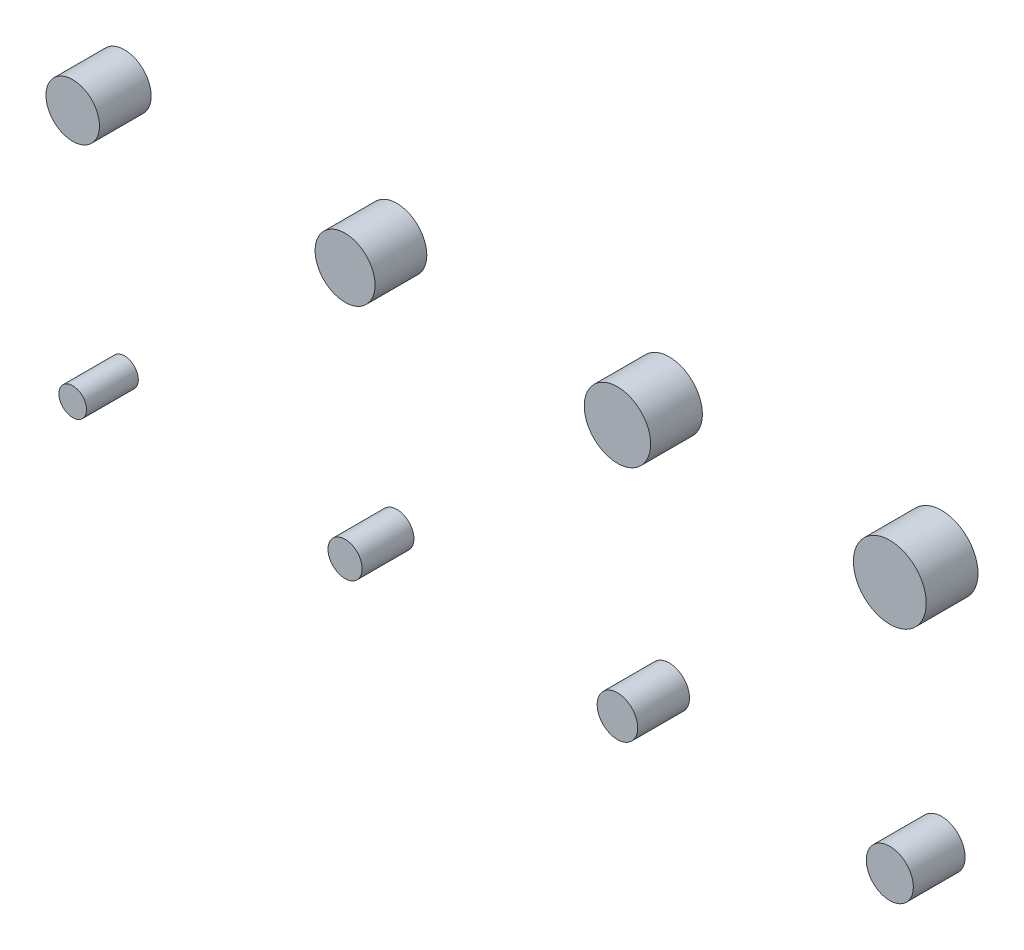
ISO-10303-21;
HEADER;
FILE_DESCRIPTION(('STEP AP214'),'2;1');
FILE_NAME('part.step','',(''),(''),'','','');
FILE_SCHEMA(('AUTOMOTIVE_DESIGN { 1 0 10303 214 1 1 1 1 }'));
ENDSEC;
DATA;
#1=APPLICATION_CONTEXT('core data for automotive mechanical design processes');
#2=APPLICATION_PROTOCOL_DEFINITION('international standard','automotive_design',2000,#1);
#3=PRODUCT_CONTEXT('',#1,'mechanical');
#4=PRODUCT('Part','Part','',(#3));
#5=PRODUCT_RELATED_PRODUCT_CATEGORY('part','',(#4));
#6=PRODUCT_DEFINITION_FORMATION('','',#4);
#7=PRODUCT_DEFINITION_CONTEXT('part definition',#1,'design');
#8=PRODUCT_DEFINITION('design','',#6,#7);
#9=PRODUCT_DEFINITION_SHAPE('','',#8);
#10=(LENGTH_UNIT() NAMED_UNIT(*) SI_UNIT(.MILLI.,.METRE.));
#11=(NAMED_UNIT(*) PLANE_ANGLE_UNIT() SI_UNIT($,.RADIAN.));
#12=(NAMED_UNIT(*) SI_UNIT($,.STERADIAN.) SOLID_ANGLE_UNIT());
#13=UNCERTAINTY_MEASURE_WITH_UNIT(LENGTH_MEASURE(1.E-05),#10,'distance_accuracy_value','');
#14=(GEOMETRIC_REPRESENTATION_CONTEXT(3) GLOBAL_UNCERTAINTY_ASSIGNED_CONTEXT((#13)) GLOBAL_UNIT_ASSIGNED_CONTEXT((#10,
#11,#12)) REPRESENTATION_CONTEXT('',''));
#15=CARTESIAN_POINT('',(0.,0.,0.));
#16=DIRECTION('',(0.,0.,1.));
#17=DIRECTION('',(1.,0.,0.));
#18=AXIS2_PLACEMENT_3D('',#15,#16,#17);
#19=CARTESIAN_POINT('',(97.964,33.418,11.731));
#20=DIRECTION('',(0.,0.,-1.));
#21=DIRECTION('',(-1.,0.,0.));
#22=AXIS2_PLACEMENT_3D('',#19,#20,#21);
#23=CYLINDRICAL_SURFACE('',#22,8.254);
#24=CARTESIAN_POINT('',(97.964,33.418,11.731));
#25=DIRECTION('',(0.,0.,1.));
#26=DIRECTION('',(1.,0.,0.));
#27=AXIS2_PLACEMENT_3D('',#24,#25,#26);
#28=CIRCLE('',#27,8.254);
#29=CARTESIAN_POINT('',(106.218,33.418,11.731));
#30=VERTEX_POINT('',#29);
#31=EDGE_CURVE('E55',#30,#30,#28,.T.);
#32=ORIENTED_EDGE('',*,*,#31,.F.);
#33=EDGE_LOOP('',(#32));
#34=FACE_BOUND('',#33,.T.);
#35=CARTESIAN_POINT('',(97.964,33.418,0.));
#36=DIRECTION('',(0.,0.,1.));
#37=DIRECTION('',(1.,0.,0.));
#38=AXIS2_PLACEMENT_3D('',#35,#36,#37);
#39=CIRCLE('',#38,8.254);
#40=CARTESIAN_POINT('',(106.218,33.418,0.));
#41=VERTEX_POINT('',#40);
#42=EDGE_CURVE('E11',#41,#41,#39,.T.);
#43=ORIENTED_EDGE('',*,*,#42,.T.);
#44=EDGE_LOOP('',(#43));
#45=FACE_BOUND('',#44,.T.);
#46=ADVANCED_FACE('F48',(#34,#45),#23,.T.);
#47=CARTESIAN_POINT('',(97.964,33.418,11.731));
#48=DIRECTION('',(0.,0.,1.));
#49=DIRECTION('',(1.,0.,0.));
#50=AXIS2_PLACEMENT_3D('',#47,#48,#49);
#51=PLANE('',#50);
#52=ORIENTED_EDGE('',*,*,#31,.T.);
#53=EDGE_LOOP('',(#52));
#54=FACE_BOUND('',#53,.T.);
#55=ADVANCED_FACE('F49',(#54),#51,.T.);
#56=CARTESIAN_POINT('',(97.964,33.418,0.));
#57=DIRECTION('',(0.,0.,1.));
#58=DIRECTION('',(1.,0.,0.));
#59=AXIS2_PLACEMENT_3D('',#56,#57,#58);
#60=PLANE('',#59);
#61=ORIENTED_EDGE('',*,*,#42,.F.);
#62=EDGE_LOOP('',(#61));
#63=FACE_BOUND('',#62,.T.);
#64=ADVANCED_FACE('F70',(#63),#60,.F.);
#65=CLOSED_SHELL('',(#46,#55,#64));
#66=MANIFOLD_SOLID_BREP('B2',#65);
#67=CARTESIAN_POINT('',(36.245,33.418,11.731));
#68=DIRECTION('',(0.,0.,-1.));
#69=DIRECTION('',(-1.,0.,0.));
#70=AXIS2_PLACEMENT_3D('',#67,#68,#69);
#71=CYLINDRICAL_SURFACE('',#70,7.523);
#72=CARTESIAN_POINT('',(36.245,33.418,11.731));
#73=DIRECTION('',(0.,0.,1.));
#74=DIRECTION('',(1.,0.,0.));
#75=AXIS2_PLACEMENT_3D('',#72,#73,#74);
#76=CIRCLE('',#75,7.523);
#77=CARTESIAN_POINT('',(43.768,33.418,11.731));
#78=VERTEX_POINT('',#77);
#79=EDGE_CURVE('E102',#78,#78,#76,.T.);
#80=ORIENTED_EDGE('',*,*,#79,.F.);
#81=EDGE_LOOP('',(#80));
#82=FACE_BOUND('',#81,.T.);
#83=CARTESIAN_POINT('',(36.245,33.418,0.));
#84=DIRECTION('',(0.,0.,1.));
#85=DIRECTION('',(1.,0.,0.));
#86=AXIS2_PLACEMENT_3D('',#83,#84,#85);
#87=CIRCLE('',#86,7.523);
#88=CARTESIAN_POINT('',(43.768,33.418,0.));
#89=VERTEX_POINT('',#88);
#90=EDGE_CURVE('E50',#89,#89,#87,.T.);
#91=ORIENTED_EDGE('',*,*,#90,.T.);
#92=EDGE_LOOP('',(#91));
#93=FACE_BOUND('',#92,.T.);
#94=ADVANCED_FACE('F100',(#82,#93),#71,.T.);
#95=CARTESIAN_POINT('',(36.245,33.418,11.731));
#96=DIRECTION('',(0.,0.,1.));
#97=DIRECTION('',(1.,0.,0.));
#98=AXIS2_PLACEMENT_3D('',#95,#96,#97);
#99=PLANE('',#98);
#100=ORIENTED_EDGE('',*,*,#79,.T.);
#101=EDGE_LOOP('',(#100));
#102=FACE_BOUND('',#101,.T.);
#103=ADVANCED_FACE('F98',(#102),#99,.T.);
#104=CARTESIAN_POINT('',(36.245,33.418,0.));
#105=DIRECTION('',(0.,0.,1.));
#106=DIRECTION('',(1.,0.,0.));
#107=AXIS2_PLACEMENT_3D('',#104,#105,#106);
#108=PLANE('',#107);
#109=ORIENTED_EDGE('',*,*,#90,.F.);
#110=EDGE_LOOP('',(#109));
#111=FACE_BOUND('',#110,.T.);
#112=ADVANCED_FACE('F117',(#111),#108,.F.);
#113=CLOSED_SHELL('',(#94,#103,#112));
#114=MANIFOLD_SOLID_BREP('B6',#113);
#115=CARTESIAN_POINT('',(-25.474,33.418,11.731));
#116=DIRECTION('',(0.,0.,-1.));
#117=DIRECTION('',(-1.,0.,0.));
#118=AXIS2_PLACEMENT_3D('',#115,#116,#117);
#119=CYLINDRICAL_SURFACE('',#118,6.792);
#120=CARTESIAN_POINT('',(-25.474,33.418,11.731));
#121=DIRECTION('',(0.,0.,1.));
#122=DIRECTION('',(1.,0.,0.));
#123=AXIS2_PLACEMENT_3D('',#120,#121,#122);
#124=CIRCLE('',#123,6.792);
#125=CARTESIAN_POINT('',(-18.682,33.418,11.731));
#126=VERTEX_POINT('',#125);
#127=EDGE_CURVE('E148',#126,#126,#124,.T.);
#128=ORIENTED_EDGE('',*,*,#127,.F.);
#129=EDGE_LOOP('',(#128));
#130=FACE_BOUND('',#129,.T.);
#131=CARTESIAN_POINT('',(-25.474,33.418,0.));
#132=DIRECTION('',(0.,0.,1.));
#133=DIRECTION('',(1.,0.,0.));
#134=AXIS2_PLACEMENT_3D('',#131,#132,#133);
#135=CIRCLE('',#134,6.792);
#136=CARTESIAN_POINT('',(-18.682,33.418,0.));
#137=VERTEX_POINT('',#136);
#138=EDGE_CURVE('E96',#137,#137,#135,.T.);
#139=ORIENTED_EDGE('',*,*,#138,.T.);
#140=EDGE_LOOP('',(#139));
#141=FACE_BOUND('',#140,.T.);
#142=ADVANCED_FACE('F147',(#130,#141),#119,.T.);
#143=CARTESIAN_POINT('',(-25.474,33.418,11.731));
#144=DIRECTION('',(0.,0.,1.));
#145=DIRECTION('',(1.,0.,0.));
#146=AXIS2_PLACEMENT_3D('',#143,#144,#145);
#147=PLANE('',#146);
#148=ORIENTED_EDGE('',*,*,#127,.T.);
#149=EDGE_LOOP('',(#148));
#150=FACE_BOUND('',#149,.T.);
#151=ADVANCED_FACE('F149',(#150),#147,.T.);
#152=CARTESIAN_POINT('',(-25.474,33.418,0.));
#153=DIRECTION('',(0.,0.,1.));
#154=DIRECTION('',(1.,0.,0.));
#155=AXIS2_PLACEMENT_3D('',#152,#153,#154);
#156=PLANE('',#155);
#157=ORIENTED_EDGE('',*,*,#138,.F.);
#158=EDGE_LOOP('',(#157));
#159=FACE_BOUND('',#158,.T.);
#160=ADVANCED_FACE('F161',(#159),#156,.F.);
#161=CLOSED_SHELL('',(#142,#151,#160));
#162=MANIFOLD_SOLID_BREP('B45',#161);
#163=CARTESIAN_POINT('',(-87.193,33.418,11.731));
#164=DIRECTION('',(0.,0.,-1.));
#165=DIRECTION('',(-1.,0.,0.));
#166=AXIS2_PLACEMENT_3D('',#163,#164,#165);
#167=CYLINDRICAL_SURFACE('',#166,6.061);
#168=CARTESIAN_POINT('',(-87.193,33.418,11.731));
#169=DIRECTION('',(0.,0.,1.));
#170=DIRECTION('',(1.,0.,0.));
#171=AXIS2_PLACEMENT_3D('',#168,#169,#170);
#172=CIRCLE('',#171,6.061);
#173=CARTESIAN_POINT('',(-81.132,33.418,11.731));
#174=VERTEX_POINT('',#173);
#175=EDGE_CURVE('E199',#174,#174,#172,.T.);
#176=ORIENTED_EDGE('',*,*,#175,.F.);
#177=EDGE_LOOP('',(#176));
#178=FACE_BOUND('',#177,.T.);
#179=CARTESIAN_POINT('',(-87.193,33.418,0.));
#180=DIRECTION('',(0.,0.,1.));
#181=DIRECTION('',(1.,0.,0.));
#182=AXIS2_PLACEMENT_3D('',#179,#180,#181);
#183=CIRCLE('',#182,6.061);
#184=CARTESIAN_POINT('',(-81.132,33.418,0.));
#185=VERTEX_POINT('',#184);
#186=EDGE_CURVE('E144',#185,#185,#183,.T.);
#187=ORIENTED_EDGE('',*,*,#186,.T.);
#188=EDGE_LOOP('',(#187));
#189=FACE_BOUND('',#188,.T.);
#190=ADVANCED_FACE('F193',(#178,#189),#167,.T.);
#191=CARTESIAN_POINT('',(-87.193,33.418,11.731));
#192=DIRECTION('',(0.,0.,1.));
#193=DIRECTION('',(1.,0.,0.));
#194=AXIS2_PLACEMENT_3D('',#191,#192,#193);
#195=PLANE('',#194);
#196=ORIENTED_EDGE('',*,*,#175,.T.);
#197=EDGE_LOOP('',(#196));
#198=FACE_BOUND('',#197,.T.);
#199=ADVANCED_FACE('F200',(#198),#195,.T.);
#200=CARTESIAN_POINT('',(-87.193,33.418,0.));
#201=DIRECTION('',(0.,0.,1.));
#202=DIRECTION('',(1.,0.,0.));
#203=AXIS2_PLACEMENT_3D('',#200,#201,#202);
#204=PLANE('',#203);
#205=ORIENTED_EDGE('',*,*,#186,.F.);
#206=EDGE_LOOP('',(#205));
#207=FACE_BOUND('',#206,.T.);
#208=ADVANCED_FACE('F215',(#207),#204,.F.);
#209=CLOSED_SHELL('',(#190,#199,#208));
#210=MANIFOLD_SOLID_BREP('B91',#209);
#211=CARTESIAN_POINT('',(97.964,-23.719,11.731));
#212=DIRECTION('',(0.,0.,-1.));
#213=DIRECTION('',(-1.,0.,0.));
#214=AXIS2_PLACEMENT_3D('',#211,#212,#213);
#215=CYLINDRICAL_SURFACE('',#214,5.33);
#216=CARTESIAN_POINT('',(97.964,-23.719,11.731));
#217=DIRECTION('',(0.,0.,1.));
#218=DIRECTION('',(1.,0.,0.));
#219=AXIS2_PLACEMENT_3D('',#216,#217,#218);
#220=CIRCLE('',#219,5.33);
#221=CARTESIAN_POINT('',(103.294,-23.719,11.731));
#222=VERTEX_POINT('',#221);
#223=EDGE_CURVE('E246',#222,#222,#220,.T.);
#224=ORIENTED_EDGE('',*,*,#223,.F.);
#225=EDGE_LOOP('',(#224));
#226=FACE_BOUND('',#225,.T.);
#227=CARTESIAN_POINT('',(97.964,-23.719,0.));
#228=DIRECTION('',(0.,0.,1.));
#229=DIRECTION('',(1.,0.,0.));
#230=AXIS2_PLACEMENT_3D('',#227,#228,#229);
#231=CIRCLE('',#230,5.33);
#232=CARTESIAN_POINT('',(103.294,-23.719,0.));
#233=VERTEX_POINT('',#232);
#234=EDGE_CURVE('E191',#233,#233,#231,.T.);
#235=ORIENTED_EDGE('',*,*,#234,.T.);
#236=EDGE_LOOP('',(#235));
#237=FACE_BOUND('',#236,.T.);
#238=ADVANCED_FACE('F244',(#226,#237),#215,.T.);
#239=CARTESIAN_POINT('',(97.964,-23.719,11.731));
#240=DIRECTION('',(0.,0.,1.));
#241=DIRECTION('',(1.,0.,0.));
#242=AXIS2_PLACEMENT_3D('',#239,#240,#241);
#243=PLANE('',#242);
#244=ORIENTED_EDGE('',*,*,#223,.T.);
#245=EDGE_LOOP('',(#244));
#246=FACE_BOUND('',#245,.T.);
#247=ADVANCED_FACE('F247',(#246),#243,.T.);
#248=CARTESIAN_POINT('',(97.964,-23.719,0.));
#249=DIRECTION('',(0.,0.,1.));
#250=DIRECTION('',(1.,0.,0.));
#251=AXIS2_PLACEMENT_3D('',#248,#249,#250);
#252=PLANE('',#251);
#253=ORIENTED_EDGE('',*,*,#234,.F.);
#254=EDGE_LOOP('',(#253));
#255=FACE_BOUND('',#254,.T.);
#256=ADVANCED_FACE('F261',(#255),#252,.F.);
#257=CLOSED_SHELL('',(#238,#247,#256));
#258=MANIFOLD_SOLID_BREP('B139',#257);
#259=CARTESIAN_POINT('',(36.245,-23.719,11.731));
#260=DIRECTION('',(0.,0.,-1.));
#261=DIRECTION('',(-1.,0.,0.));
#262=AXIS2_PLACEMENT_3D('',#259,#260,#261);
#263=CYLINDRICAL_SURFACE('',#262,4.599);
#264=CARTESIAN_POINT('',(36.245,-23.719,11.731));
#265=DIRECTION('',(0.,0.,1.));
#266=DIRECTION('',(1.,0.,0.));
#267=AXIS2_PLACEMENT_3D('',#264,#265,#266);
#268=CIRCLE('',#267,4.599);
#269=CARTESIAN_POINT('',(40.844,-23.719,11.731));
#270=VERTEX_POINT('',#269);
#271=EDGE_CURVE('E300',#270,#270,#268,.T.);
#272=ORIENTED_EDGE('',*,*,#271,.F.);
#273=EDGE_LOOP('',(#272));
#274=FACE_BOUND('',#273,.T.);
#275=CARTESIAN_POINT('',(36.245,-23.719,0.));
#276=DIRECTION('',(0.,0.,1.));
#277=DIRECTION('',(1.,0.,0.));
#278=AXIS2_PLACEMENT_3D('',#275,#276,#277);
#279=CIRCLE('',#278,4.599);
#280=CARTESIAN_POINT('',(40.844,-23.719,0.));
#281=VERTEX_POINT('',#280);
#282=EDGE_CURVE('E243',#281,#281,#279,.T.);
#283=ORIENTED_EDGE('',*,*,#282,.T.);
#284=EDGE_LOOP('',(#283));
#285=FACE_BOUND('',#284,.T.);
#286=ADVANCED_FACE('F291',(#274,#285),#263,.T.);
#287=CARTESIAN_POINT('',(36.245,-23.719,11.731));
#288=DIRECTION('',(0.,0.,1.));
#289=DIRECTION('',(1.,0.,0.));
#290=AXIS2_PLACEMENT_3D('',#287,#288,#289);
#291=PLANE('',#290);
#292=ORIENTED_EDGE('',*,*,#271,.T.);
#293=EDGE_LOOP('',(#292));
#294=FACE_BOUND('',#293,.T.);
#295=ADVANCED_FACE('F293',(#294),#291,.T.);
#296=CARTESIAN_POINT('',(36.245,-23.719,0.));
#297=DIRECTION('',(0.,0.,1.));
#298=DIRECTION('',(1.,0.,0.));
#299=AXIS2_PLACEMENT_3D('',#296,#297,#298);
#300=PLANE('',#299);
#301=ORIENTED_EDGE('',*,*,#282,.F.);
#302=EDGE_LOOP('',(#301));
#303=FACE_BOUND('',#302,.T.);
#304=ADVANCED_FACE('F315',(#303),#300,.F.);
#305=CLOSED_SHELL('',(#286,#295,#304));
#306=MANIFOLD_SOLID_BREP('B188',#305);
#307=CARTESIAN_POINT('',(-25.474,-23.719,11.731));
#308=DIRECTION('',(0.,0.,-1.));
#309=DIRECTION('',(-1.,0.,0.));
#310=AXIS2_PLACEMENT_3D('',#307,#308,#309);
#311=CYLINDRICAL_SURFACE('',#310,3.868);
#312=CARTESIAN_POINT('',(-25.474,-23.719,11.731));
#313=DIRECTION('',(0.,0.,1.));
#314=DIRECTION('',(1.,0.,0.));
#315=AXIS2_PLACEMENT_3D('',#312,#313,#314);
#316=CIRCLE('',#315,3.868);
#317=CARTESIAN_POINT('',(-21.606,-23.719,11.731));
#318=VERTEX_POINT('',#317);
#319=EDGE_CURVE('E341',#318,#318,#316,.T.);
#320=ORIENTED_EDGE('',*,*,#319,.F.);
#321=EDGE_LOOP('',(#320));
#322=FACE_BOUND('',#321,.T.);
#323=CARTESIAN_POINT('',(-25.474,-23.719,0.));
#324=DIRECTION('',(0.,0.,1.));
#325=DIRECTION('',(1.,0.,0.));
#326=AXIS2_PLACEMENT_3D('',#323,#324,#325);
#327=CIRCLE('',#326,3.868);
#328=CARTESIAN_POINT('',(-21.606,-23.719,0.));
#329=VERTEX_POINT('',#328);
#330=EDGE_CURVE('E295',#329,#329,#327,.T.);
#331=ORIENTED_EDGE('',*,*,#330,.T.);
#332=EDGE_LOOP('',(#331));
#333=FACE_BOUND('',#332,.T.);
#334=ADVANCED_FACE('F342',(#322,#333),#311,.T.);
#335=CARTESIAN_POINT('',(-25.474,-23.719,11.731));
#336=DIRECTION('',(0.,0.,1.));
#337=DIRECTION('',(1.,0.,0.));
#338=AXIS2_PLACEMENT_3D('',#335,#336,#337);
#339=PLANE('',#338);
#340=ORIENTED_EDGE('',*,*,#319,.T.);
#341=EDGE_LOOP('',(#340));
#342=FACE_BOUND('',#341,.T.);
#343=ADVANCED_FACE('F343',(#342),#339,.T.);
#344=CARTESIAN_POINT('',(-25.474,-23.719,0.));
#345=DIRECTION('',(0.,0.,1.));
#346=DIRECTION('',(1.,0.,0.));
#347=AXIS2_PLACEMENT_3D('',#344,#345,#346);
#348=PLANE('',#347);
#349=ORIENTED_EDGE('',*,*,#330,.F.);
#350=EDGE_LOOP('',(#349));
#351=FACE_BOUND('',#350,.T.);
#352=ADVANCED_FACE('F359',(#351),#348,.F.);
#353=CLOSED_SHELL('',(#334,#343,#352));
#354=MANIFOLD_SOLID_BREP('B239',#353);
#355=CARTESIAN_POINT('',(-87.193,-23.719,11.731));
#356=DIRECTION('',(0.,0.,-1.));
#357=DIRECTION('',(-1.,0.,0.));
#358=AXIS2_PLACEMENT_3D('',#355,#356,#357);
#359=CYLINDRICAL_SURFACE('',#358,3.137);
#360=CARTESIAN_POINT('',(-87.193,-23.719,11.731));
#361=DIRECTION('',(0.,0.,1.));
#362=DIRECTION('',(1.,0.,0.));
#363=AXIS2_PLACEMENT_3D('',#360,#361,#362);
#364=CIRCLE('',#363,3.137);
#365=CARTESIAN_POINT('',(-84.056,-23.719,11.731));
#366=VERTEX_POINT('',#365);
#367=EDGE_CURVE('E338',#366,#366,#364,.T.);
#368=ORIENTED_EDGE('',*,*,#367,.F.);
#369=EDGE_LOOP('',(#368));
#370=FACE_BOUND('',#369,.T.);
#371=CARTESIAN_POINT('',(-87.193,-23.719,0.));
#372=DIRECTION('',(0.,0.,1.));
#373=DIRECTION('',(1.,0.,0.));
#374=AXIS2_PLACEMENT_3D('',#371,#372,#373);
#375=CIRCLE('',#374,3.137);
#376=CARTESIAN_POINT('',(-84.056,-23.719,0.));
#377=VERTEX_POINT('',#376);
#378=EDGE_CURVE('E383',#377,#377,#375,.T.);
#379=ORIENTED_EDGE('',*,*,#378,.T.);
#380=EDGE_LOOP('',(#379));
#381=FACE_BOUND('',#380,.T.);
#382=ADVANCED_FACE('F385',(#370,#381),#359,.T.);
#383=CARTESIAN_POINT('',(-87.193,-23.719,11.731));
#384=DIRECTION('',(0.,0.,1.));
#385=DIRECTION('',(1.,0.,0.));
#386=AXIS2_PLACEMENT_3D('',#383,#384,#385);
#387=PLANE('',#386);
#388=ORIENTED_EDGE('',*,*,#367,.T.);
#389=EDGE_LOOP('',(#388));
#390=FACE_BOUND('',#389,.T.);
#391=ADVANCED_FACE('F400',(#390),#387,.T.);
#392=CARTESIAN_POINT('',(-87.193,-23.719,0.));
#393=DIRECTION('',(0.,0.,1.));
#394=DIRECTION('',(1.,0.,0.));
#395=AXIS2_PLACEMENT_3D('',#392,#393,#394);
#396=PLANE('',#395);
#397=ORIENTED_EDGE('',*,*,#378,.F.);
#398=EDGE_LOOP('',(#397));
#399=FACE_BOUND('',#398,.T.);
#400=ADVANCED_FACE('F394',(#399),#396,.F.);
#401=CLOSED_SHELL('',(#382,#391,#400));
#402=MANIFOLD_SOLID_BREP('B290',#401);
#403=ADVANCED_BREP_SHAPE_REPRESENTATION('',(#18,#66,#114,#162,#210,#258,#306,#354,#402),#14);
#404=SHAPE_DEFINITION_REPRESENTATION(#9,#403);
ENDSEC;
END-ISO-10303-21;
